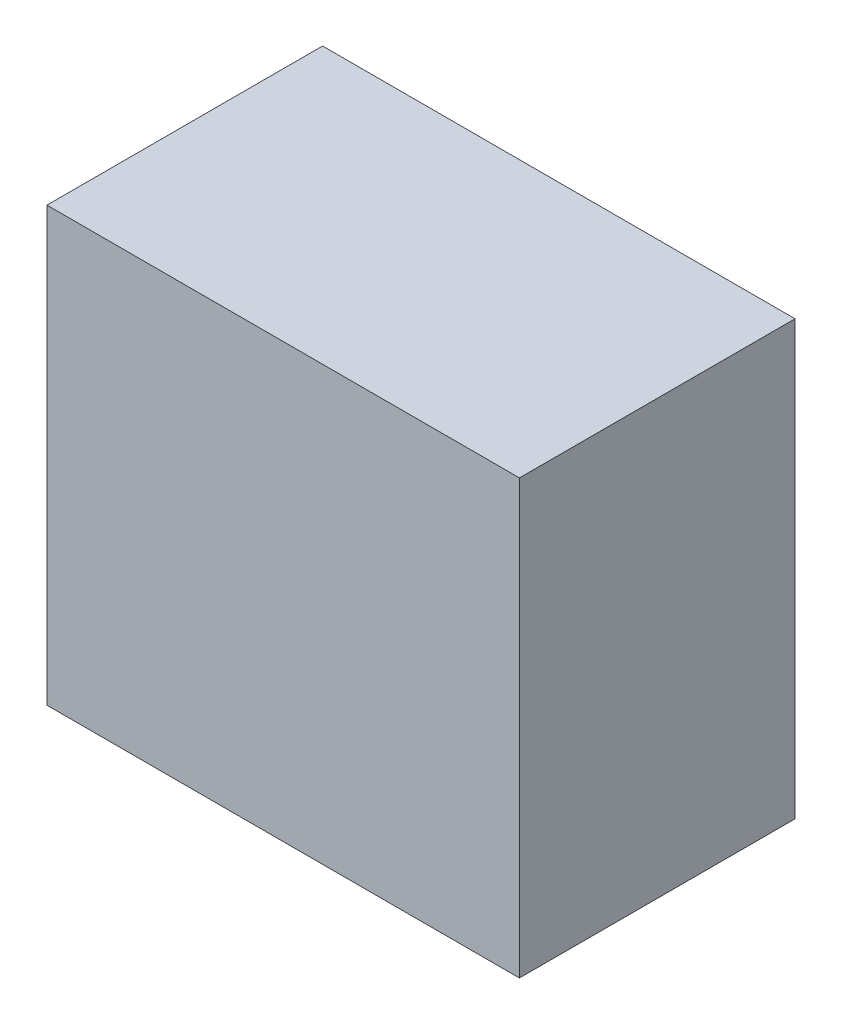
ISO-10303-21;
HEADER;
FILE_DESCRIPTION(('STEP AP214'),'2;1');
FILE_NAME('part.step','',(''),(''),'','','');
FILE_SCHEMA(('AUTOMOTIVE_DESIGN { 1 0 10303 214 1 1 1 1 }'));
ENDSEC;
DATA;
#1=APPLICATION_CONTEXT('core data for automotive mechanical design processes');
#2=APPLICATION_PROTOCOL_DEFINITION('international standard','automotive_design',2000,#1);
#3=PRODUCT_CONTEXT('',#1,'mechanical');
#4=PRODUCT('Part','Part','',(#3));
#5=PRODUCT_RELATED_PRODUCT_CATEGORY('part','',(#4));
#6=PRODUCT_DEFINITION_FORMATION('','',#4);
#7=PRODUCT_DEFINITION_CONTEXT('part definition',#1,'design');
#8=PRODUCT_DEFINITION('design','',#6,#7);
#9=PRODUCT_DEFINITION_SHAPE('','',#8);
#10=(LENGTH_UNIT() NAMED_UNIT(*) SI_UNIT(.MILLI.,.METRE.));
#11=(NAMED_UNIT(*) PLANE_ANGLE_UNIT() SI_UNIT($,.RADIAN.));
#12=(NAMED_UNIT(*) SI_UNIT($,.STERADIAN.) SOLID_ANGLE_UNIT());
#13=UNCERTAINTY_MEASURE_WITH_UNIT(LENGTH_MEASURE(1.E-05),#10,'distance_accuracy_value','');
#14=(GEOMETRIC_REPRESENTATION_CONTEXT(3) GLOBAL_UNCERTAINTY_ASSIGNED_CONTEXT((#13)) GLOBAL_UNIT_ASSIGNED_CONTEXT((#10,
#11,#12)) REPRESENTATION_CONTEXT('',''));
#15=CARTESIAN_POINT('',(0.,0.,0.));
#16=DIRECTION('',(0.,0.,1.));
#17=DIRECTION('',(1.,0.,0.));
#18=AXIS2_PLACEMENT_3D('',#15,#16,#17);
#19=CARTESIAN_POINT('',(152.4,139.7,177.8));
#20=DIRECTION('',(-1.,0.,0.));
#21=DIRECTION('',(0.,-1.,0.));
#22=AXIS2_PLACEMENT_3D('',#19,#20,#21);
#23=PLANE('',#22);
#24=DIRECTION('',(0.,1.,0.));
#25=VECTOR('',#24,1.);
#26=CARTESIAN_POINT('',(152.4,139.7,0.));
#27=LINE('',#26,#25);
#28=CARTESIAN_POINT('',(152.4,-139.7,0.));
#29=VERTEX_POINT('',#28);
#30=CARTESIAN_POINT('',(152.4,139.7,0.));
#31=VERTEX_POINT('',#30);
#32=EDGE_CURVE('E113',#29,#31,#27,.T.);
#33=ORIENTED_EDGE('',*,*,#32,.T.);
#34=DIRECTION('',(0.,0.,-1.));
#35=VECTOR('',#34,1.);
#36=CARTESIAN_POINT('',(152.4,139.7,177.8));
#37=LINE('',#36,#35);
#38=CARTESIAN_POINT('',(152.4,139.7,177.8));
#39=VERTEX_POINT('',#38);
#40=EDGE_CURVE('E11',#39,#31,#37,.T.);
#41=ORIENTED_EDGE('',*,*,#40,.F.);
#42=DIRECTION('',(0.,1.,0.));
#43=VECTOR('',#42,1.);
#44=CARTESIAN_POINT('',(152.4,139.7,177.8));
#45=LINE('',#44,#43);
#46=CARTESIAN_POINT('',(152.4,-139.7,177.8));
#47=VERTEX_POINT('',#46);
#48=EDGE_CURVE('E97',#47,#39,#45,.T.);
#49=ORIENTED_EDGE('',*,*,#48,.F.);
#50=DIRECTION('',(0.,0.,-1.));
#51=VECTOR('',#50,1.);
#52=CARTESIAN_POINT('',(152.4,-139.7,177.8));
#53=LINE('',#52,#51);
#54=EDGE_CURVE('E109',#47,#29,#53,.T.);
#55=ORIENTED_EDGE('',*,*,#54,.T.);
#56=EDGE_LOOP('',(#33,#41,#49,#55));
#57=FACE_BOUND('',#56,.T.);
#58=ADVANCED_FACE('F45',(#57),#23,.F.);
#59=CARTESIAN_POINT('',(-152.4,139.7,177.8));
#60=DIRECTION('',(0.,-1.,0.));
#61=DIRECTION('',(0.,0.,-1.));
#62=AXIS2_PLACEMENT_3D('',#59,#60,#61);
#63=PLANE('',#62);
#64=DIRECTION('',(-1.,0.,0.));
#65=VECTOR('',#64,1.);
#66=CARTESIAN_POINT('',(-152.4,139.7,0.));
#67=LINE('',#66,#65);
#68=CARTESIAN_POINT('',(-152.4,139.7,0.));
#69=VERTEX_POINT('',#68);
#70=EDGE_CURVE('E102',#31,#69,#67,.T.);
#71=ORIENTED_EDGE('',*,*,#70,.T.);
#72=DIRECTION('',(0.,0.,-1.));
#73=VECTOR('',#72,1.);
#74=CARTESIAN_POINT('',(-152.4,139.7,177.8));
#75=LINE('',#74,#73);
#76=CARTESIAN_POINT('',(-152.4,139.7,177.8));
#77=VERTEX_POINT('',#76);
#78=EDGE_CURVE('E54',#77,#69,#75,.T.);
#79=ORIENTED_EDGE('',*,*,#78,.F.);
#80=DIRECTION('',(-1.,0.,0.));
#81=VECTOR('',#80,1.);
#82=CARTESIAN_POINT('',(-152.4,139.7,177.8));
#83=LINE('',#82,#81);
#84=EDGE_CURVE('E92',#39,#77,#83,.T.);
#85=ORIENTED_EDGE('',*,*,#84,.F.);
#86=ORIENTED_EDGE('',*,*,#40,.T.);
#87=EDGE_LOOP('',(#71,#79,#85,#86));
#88=FACE_BOUND('',#87,.T.);
#89=ADVANCED_FACE('F101',(#88),#63,.F.);
#90=CARTESIAN_POINT('',(-152.4,139.7,177.8));
#91=DIRECTION('',(1.,0.,0.));
#92=DIRECTION('',(0.,1.,0.));
#93=AXIS2_PLACEMENT_3D('',#90,#91,#92);
#94=PLANE('',#93);
#95=DIRECTION('',(0.,-1.,0.));
#96=VECTOR('',#95,1.);
#97=CARTESIAN_POINT('',(-152.4,139.7,0.));
#98=LINE('',#97,#96);
#99=CARTESIAN_POINT('',(-152.4,-139.7,0.));
#100=VERTEX_POINT('',#99);
#101=EDGE_CURVE('E79',#69,#100,#98,.T.);
#102=ORIENTED_EDGE('',*,*,#101,.T.);
#103=DIRECTION('',(0.,0.,-1.));
#104=VECTOR('',#103,1.);
#105=CARTESIAN_POINT('',(-152.4,-139.7,177.8));
#106=LINE('',#105,#104);
#107=CARTESIAN_POINT('',(-152.4,-139.7,177.8));
#108=VERTEX_POINT('',#107);
#109=EDGE_CURVE('E104',#108,#100,#106,.T.);
#110=ORIENTED_EDGE('',*,*,#109,.F.);
#111=DIRECTION('',(0.,-1.,0.));
#112=VECTOR('',#111,1.);
#113=CARTESIAN_POINT('',(-152.4,139.7,177.8));
#114=LINE('',#113,#112);
#115=EDGE_CURVE('E95',#77,#108,#114,.T.);
#116=ORIENTED_EDGE('',*,*,#115,.F.);
#117=ORIENTED_EDGE('',*,*,#78,.T.);
#118=EDGE_LOOP('',(#102,#110,#116,#117));
#119=FACE_BOUND('',#118,.T.);
#120=ADVANCED_FACE('F105',(#119),#94,.F.);
#121=CARTESIAN_POINT('',(-152.4,-139.7,177.8));
#122=DIRECTION('',(0.,1.,0.));
#123=DIRECTION('',(0.,0.,1.));
#124=AXIS2_PLACEMENT_3D('',#121,#122,#123);
#125=PLANE('',#124);
#126=DIRECTION('',(1.,0.,0.));
#127=VECTOR('',#126,1.);
#128=CARTESIAN_POINT('',(-152.4,-139.7,0.));
#129=LINE('',#128,#127);
#130=EDGE_CURVE('E85',#100,#29,#129,.T.);
#131=ORIENTED_EDGE('',*,*,#130,.T.);
#132=ORIENTED_EDGE('',*,*,#54,.F.);
#133=DIRECTION('',(1.,0.,0.));
#134=VECTOR('',#133,1.);
#135=CARTESIAN_POINT('',(-152.4,-139.7,177.8));
#136=LINE('',#135,#134);
#137=EDGE_CURVE('E62',#108,#47,#136,.T.);
#138=ORIENTED_EDGE('',*,*,#137,.F.);
#139=ORIENTED_EDGE('',*,*,#109,.T.);
#140=EDGE_LOOP('',(#131,#132,#138,#139));
#141=FACE_BOUND('',#140,.T.);
#142=ADVANCED_FACE('F126',(#141),#125,.F.);
#143=CARTESIAN_POINT('',(0.,0.,177.8));
#144=DIRECTION('',(0.,0.,1.));
#145=DIRECTION('',(1.,0.,0.));
#146=AXIS2_PLACEMENT_3D('',#143,#144,#145);
#147=PLANE('',#146);
#148=ORIENTED_EDGE('',*,*,#48,.T.);
#149=ORIENTED_EDGE('',*,*,#84,.T.);
#150=ORIENTED_EDGE('',*,*,#115,.T.);
#151=ORIENTED_EDGE('',*,*,#137,.T.);
#152=EDGE_LOOP('',(#148,#149,#150,#151));
#153=FACE_BOUND('',#152,.T.);
#154=ADVANCED_FACE('F93',(#153),#147,.T.);
#155=CARTESIAN_POINT('',(0.,0.,0.));
#156=DIRECTION('',(0.,0.,1.));
#157=DIRECTION('',(1.,0.,0.));
#158=AXIS2_PLACEMENT_3D('',#155,#156,#157);
#159=PLANE('',#158);
#160=ORIENTED_EDGE('',*,*,#32,.F.);
#161=ORIENTED_EDGE('',*,*,#130,.F.);
#162=ORIENTED_EDGE('',*,*,#101,.F.);
#163=ORIENTED_EDGE('',*,*,#70,.F.);
#164=EDGE_LOOP('',(#160,#161,#162,#163));
#165=FACE_BOUND('',#164,.T.);
#166=ADVANCED_FACE('F129',(#165),#159,.F.);
#167=CLOSED_SHELL('',(#58,#89,#120,#142,#154,#166));
#168=MANIFOLD_SOLID_BREP('B2',#167);
#169=ADVANCED_BREP_SHAPE_REPRESENTATION('',(#18,#168),#14);
#170=SHAPE_DEFINITION_REPRESENTATION(#9,#169);
ENDSEC;
END-ISO-10303-21;
